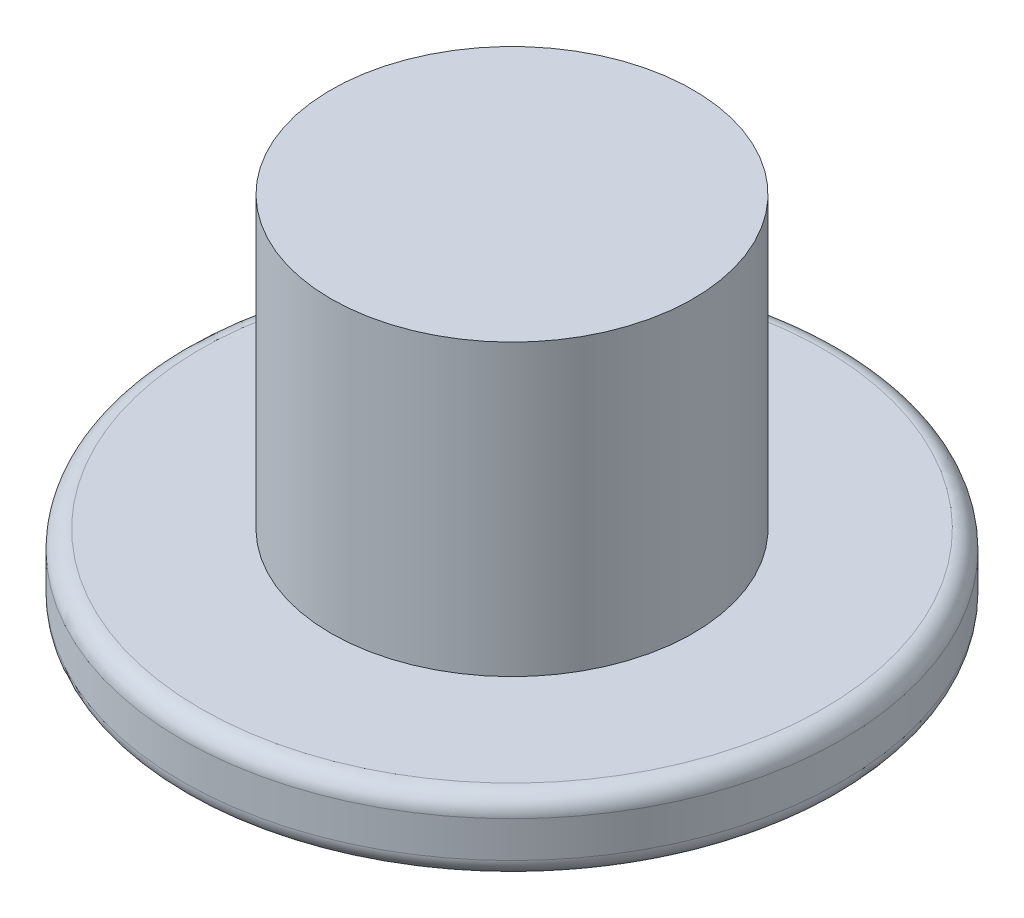
ISO-10303-21;
HEADER;
FILE_DESCRIPTION(('STEP AP214'),'2;1');
FILE_NAME('part.step','',(''),(''),'','','');
FILE_SCHEMA(('AUTOMOTIVE_DESIGN { 1 0 10303 214 1 1 1 1 }'));
ENDSEC;
DATA;
#1=APPLICATION_CONTEXT('core data for automotive mechanical design processes');
#2=APPLICATION_PROTOCOL_DEFINITION('international standard','automotive_design',2000,#1);
#3=PRODUCT_CONTEXT('',#1,'mechanical');
#4=PRODUCT('Part','Part','',(#3));
#5=PRODUCT_RELATED_PRODUCT_CATEGORY('part','',(#4));
#6=PRODUCT_DEFINITION_FORMATION('','',#4);
#7=PRODUCT_DEFINITION_CONTEXT('part definition',#1,'design');
#8=PRODUCT_DEFINITION('design','',#6,#7);
#9=PRODUCT_DEFINITION_SHAPE('','',#8);
#10=(LENGTH_UNIT() NAMED_UNIT(*) SI_UNIT(.MILLI.,.METRE.));
#11=(NAMED_UNIT(*) PLANE_ANGLE_UNIT() SI_UNIT($,.RADIAN.));
#12=(NAMED_UNIT(*) SI_UNIT($,.STERADIAN.) SOLID_ANGLE_UNIT());
#13=UNCERTAINTY_MEASURE_WITH_UNIT(LENGTH_MEASURE(1.E-05),#10,'distance_accuracy_value','');
#14=(GEOMETRIC_REPRESENTATION_CONTEXT(3) GLOBAL_UNCERTAINTY_ASSIGNED_CONTEXT((#13)) GLOBAL_UNIT_ASSIGNED_CONTEXT((#10,
#11,#12)) REPRESENTATION_CONTEXT('',''));
#15=CARTESIAN_POINT('',(0.,0.,0.));
#16=DIRECTION('',(0.,0.,1.));
#17=DIRECTION('',(1.,0.,0.));
#18=AXIS2_PLACEMENT_3D('',#15,#16,#17);
#19=CARTESIAN_POINT('',(-5.40867619744746,0.,40.306737900425));
#20=DIRECTION('',(0.,1.,0.));
#21=DIRECTION('',(0.,0.,1.));
#22=AXIS2_PLACEMENT_3D('',#19,#20,#21);
#23=PLANE('',#22);
#24=CARTESIAN_POINT('',(-5.40867619744746,0.,40.306737900425));
#25=DIRECTION('',(0.,1.,0.));
#26=DIRECTION('',(0.,0.,1.));
#27=AXIS2_PLACEMENT_3D('',#24,#25,#26);
#28=CIRCLE('',#27,8.6);
#29=CARTESIAN_POINT('',(-5.40867619744746,0.,48.906737900425));
#30=VERTEX_POINT('',#29);
#31=EDGE_CURVE('E11',#30,#30,#28,.F.);
#32=ORIENTED_EDGE('',*,*,#31,.T.);
#33=EDGE_LOOP('',(#32));
#34=FACE_BOUND('',#33,.T.);
#35=DIRECTION('',(0.487957207872981,0.,0.872867551971549));
#36=VECTOR('',#35,1.);
#37=CARTESIAN_POINT('',(-7.02368786685276,0.,43.7669081742189));
#38=LINE('',#37,#36);
#39=CARTESIAN_POINT('',(-7.02368786685276,0.,43.7669081742189));
#40=VERTEX_POINT('',#39);
#41=CARTESIAN_POINT('',(-6.44315902069891,0.,44.8053697126805));
#42=VERTEX_POINT('',#41);
#43=EDGE_CURVE('E55',#40,#42,#38,.T.);
#44=ORIENTED_EDGE('',*,*,#43,.T.);
#45=DIRECTION('',(1.,0.,0.));
#46=VECTOR('',#45,1.);
#47=CARTESIAN_POINT('',(-6.44315902069891,0.,44.8053697126805));
#48=LINE('',#47,#46);
#49=CARTESIAN_POINT('',(-4.48522632839122,0.,44.8053697126805));
#50=VERTEX_POINT('',#49);
#51=EDGE_CURVE('E131',#42,#50,#48,.T.);
#52=ORIENTED_EDGE('',*,*,#51,.T.);
#53=DIRECTION('',(0.,0.,-1.));
#54=VECTOR('',#53,1.);
#55=CARTESIAN_POINT('',(-4.48522632839122,0.,44.8053697126805));
#56=LINE('',#55,#54);
#57=CARTESIAN_POINT('',(-4.48522632839122,0.,35.8053697126805));
#58=VERTEX_POINT('',#57);
#59=EDGE_CURVE('E135',#50,#58,#56,.T.);
#60=ORIENTED_EDGE('',*,*,#59,.T.);
#61=DIRECTION('',(-1.,0.,0.));
#62=VECTOR('',#61,1.);
#63=CARTESIAN_POINT('',(-4.48522632839122,0.,35.8053697126805));
#64=LINE('',#63,#62);
#65=CARTESIAN_POINT('',(-5.63907248223737,0.,35.8053697126805));
#66=VERTEX_POINT('',#65);
#67=EDGE_CURVE('E139',#58,#66,#64,.T.);
#68=ORIENTED_EDGE('',*,*,#67,.T.);
#69=DIRECTION('',(0.,0.,1.));
#70=VECTOR('',#69,1.);
#71=CARTESIAN_POINT('',(-5.63907248223737,0.,35.8053697126805));
#72=LINE('',#71,#70);
#73=CARTESIAN_POINT('',(-5.63907248223737,0.,43.7669081742189));
#74=VERTEX_POINT('',#73);
#75=EDGE_CURVE('E117',#66,#74,#72,.T.);
#76=ORIENTED_EDGE('',*,*,#75,.T.);
#77=DIRECTION('',(-1.,0.,0.));
#78=VECTOR('',#77,1.);
#79=CARTESIAN_POINT('',(-5.63907248223737,0.,43.7669081742189));
#80=LINE('',#79,#78);
#81=EDGE_CURVE('E144',#74,#40,#80,.T.);
#82=ORIENTED_EDGE('',*,*,#81,.T.);
#83=EDGE_LOOP('',(#44,#52,#60,#68,#76,#82));
#84=FACE_BOUND('',#83,.T.);
#85=ADVANCED_FACE('F39',(#34,#84),#23,.F.);
#86=CARTESIAN_POINT('',(-5.40867619744746,2.,40.306737900425));
#87=DIRECTION('',(0.,-1.,0.));
#88=DIRECTION('',(0.,0.,-1.));
#89=AXIS2_PLACEMENT_3D('',#86,#87,#88);
#90=CYLINDRICAL_SURFACE('',#89,9.1);
#91=CARTESIAN_POINT('',(-5.40867619744746,1.5,40.306737900425));
#92=DIRECTION('',(0.,1.,0.));
#93=DIRECTION('',(0.,0.,1.));
#94=AXIS2_PLACEMENT_3D('',#91,#92,#93);
#95=CIRCLE('',#94,9.1);
#96=CARTESIAN_POINT('',(-5.40867619744746,1.5,49.406737900425));
#97=VERTEX_POINT('',#96);
#98=EDGE_CURVE('E48',#97,#97,#95,.F.);
#99=ORIENTED_EDGE('',*,*,#98,.T.);
#100=EDGE_LOOP('',(#99));
#101=FACE_BOUND('',#100,.T.);
#102=CARTESIAN_POINT('',(-5.40867619744746,0.5,40.306737900425));
#103=DIRECTION('',(0.,1.,0.));
#104=DIRECTION('',(0.,0.,1.));
#105=AXIS2_PLACEMENT_3D('',#102,#103,#104);
#106=CIRCLE('',#105,9.1);
#107=CARTESIAN_POINT('',(-5.40867619744746,0.5,49.406737900425));
#108=VERTEX_POINT('',#107);
#109=EDGE_CURVE('E173',#108,#108,#106,.T.);
#110=ORIENTED_EDGE('',*,*,#109,.T.);
#111=EDGE_LOOP('',(#110));
#112=FACE_BOUND('',#111,.T.);
#113=ADVANCED_FACE('F180',(#101,#112),#90,.T.);
#114=CARTESIAN_POINT('',(-5.40867619744746,2.,40.306737900425));
#115=DIRECTION('',(0.,1.,0.));
#116=DIRECTION('',(0.,0.,1.));
#117=AXIS2_PLACEMENT_3D('',#114,#115,#116);
#118=PLANE('',#117);
#119=CARTESIAN_POINT('',(-5.40867619744746,2.,40.306737900425));
#120=DIRECTION('',(0.,1.,0.));
#121=DIRECTION('',(0.,0.,1.));
#122=AXIS2_PLACEMENT_3D('',#119,#120,#121);
#123=CIRCLE('',#122,8.6);
#124=CARTESIAN_POINT('',(-5.40867619744746,2.,48.906737900425));
#125=VERTEX_POINT('',#124);
#126=EDGE_CURVE('E169',#125,#125,#123,.T.);
#127=ORIENTED_EDGE('',*,*,#126,.T.);
#128=EDGE_LOOP('',(#127));
#129=FACE_BOUND('',#128,.T.);
#130=CARTESIAN_POINT('',(-5.40867619744746,2.,40.306737900425));
#131=DIRECTION('',(0.,1.,0.));
#132=DIRECTION('',(0.,0.,1.));
#133=AXIS2_PLACEMENT_3D('',#130,#131,#132);
#134=CIRCLE('',#133,5.);
#135=CARTESIAN_POINT('',(-5.40867619744746,2.,45.306737900425));
#136=VERTEX_POINT('',#135);
#137=EDGE_CURVE('E165',#136,#136,#134,.T.);
#138=ORIENTED_EDGE('',*,*,#137,.F.);
#139=EDGE_LOOP('',(#138));
#140=FACE_BOUND('',#139,.T.);
#141=ADVANCED_FACE('F188',(#129,#140),#118,.T.);
#142=CARTESIAN_POINT('',(-5.40867619744746,10.,40.306737900425));
#143=DIRECTION('',(0.,-1.,0.));
#144=DIRECTION('',(0.,0.,-1.));
#145=AXIS2_PLACEMENT_3D('',#142,#143,#144);
#146=CYLINDRICAL_SURFACE('',#145,5.);
#147=CARTESIAN_POINT('',(-5.40867619744746,10.,40.306737900425));
#148=DIRECTION('',(0.,1.,0.));
#149=DIRECTION('',(0.,0.,1.));
#150=AXIS2_PLACEMENT_3D('',#147,#148,#149);
#151=CIRCLE('',#150,5.);
#152=CARTESIAN_POINT('',(-5.40867619744746,10.,45.306737900425));
#153=VERTEX_POINT('',#152);
#154=EDGE_CURVE('E161',#153,#153,#151,.T.);
#155=ORIENTED_EDGE('',*,*,#154,.F.);
#156=EDGE_LOOP('',(#155));
#157=FACE_BOUND('',#156,.T.);
#158=ORIENTED_EDGE('',*,*,#137,.T.);
#159=EDGE_LOOP('',(#158));
#160=FACE_BOUND('',#159,.T.);
#161=ADVANCED_FACE('F191',(#157,#160),#146,.T.);
#162=CARTESIAN_POINT('',(-5.40867619744746,10.,40.306737900425));
#163=DIRECTION('',(0.,1.,0.));
#164=DIRECTION('',(0.,0.,1.));
#165=AXIS2_PLACEMENT_3D('',#162,#163,#164);
#166=PLANE('',#165);
#167=ORIENTED_EDGE('',*,*,#154,.T.);
#168=EDGE_LOOP('',(#167));
#169=FACE_BOUND('',#168,.T.);
#170=ADVANCED_FACE('F196',(#169),#166,.T.);
#171=CARTESIAN_POINT('',(-7.02368786685276,0.5,43.7669081742189));
#172=DIRECTION('',(0.872867551971549,0.,-0.487957207872981));
#173=DIRECTION('',(-0.487957207872981,0.,-0.872867551971549));
#174=AXIS2_PLACEMENT_3D('',#171,#172,#173);
#175=PLANE('',#174);
#176=ORIENTED_EDGE('',*,*,#43,.F.);
#177=DIRECTION('',(0.,-1.,0.));
#178=VECTOR('',#177,1.);
#179=CARTESIAN_POINT('',(-7.02368786685276,0.5,43.7669081742189));
#180=LINE('',#179,#178);
#181=CARTESIAN_POINT('',(-7.02368786685276,0.5,43.7669081742189));
#182=VERTEX_POINT('',#181);
#183=EDGE_CURVE('E125',#182,#40,#180,.T.);
#184=ORIENTED_EDGE('',*,*,#183,.F.);
#185=DIRECTION('',(0.487957207872981,0.,0.872867551971549));
#186=VECTOR('',#185,1.);
#187=CARTESIAN_POINT('',(-7.02368786685276,0.5,43.7669081742189));
#188=LINE('',#187,#186);
#189=CARTESIAN_POINT('',(-6.44315902069891,0.5,44.8053697126805));
#190=VERTEX_POINT('',#189);
#191=EDGE_CURVE('E148',#182,#190,#188,.T.);
#192=ORIENTED_EDGE('',*,*,#191,.T.);
#193=DIRECTION('',(0.,-1.,0.));
#194=VECTOR('',#193,1.);
#195=CARTESIAN_POINT('',(-6.44315902069891,0.5,44.8053697126805));
#196=LINE('',#195,#194);
#197=EDGE_CURVE('E158',#190,#42,#196,.T.);
#198=ORIENTED_EDGE('',*,*,#197,.T.);
#199=EDGE_LOOP('',(#176,#184,#192,#198));
#200=FACE_BOUND('',#199,.T.);
#201=ADVANCED_FACE('F202',(#200),#175,.T.);
#202=CARTESIAN_POINT('',(-6.44315902069891,0.5,44.8053697126805));
#203=DIRECTION('',(0.,0.,-1.));
#204=DIRECTION('',(-1.,0.,0.));
#205=AXIS2_PLACEMENT_3D('',#202,#203,#204);
#206=PLANE('',#205);
#207=ORIENTED_EDGE('',*,*,#51,.F.);
#208=ORIENTED_EDGE('',*,*,#197,.F.);
#209=DIRECTION('',(1.,0.,0.));
#210=VECTOR('',#209,1.);
#211=CARTESIAN_POINT('',(-6.44315902069891,0.5,44.8053697126805));
#212=LINE('',#211,#210);
#213=CARTESIAN_POINT('',(-4.48522632839122,0.5,44.8053697126805));
#214=VERTEX_POINT('',#213);
#215=EDGE_CURVE('E94',#190,#214,#212,.T.);
#216=ORIENTED_EDGE('',*,*,#215,.T.);
#217=DIRECTION('',(0.,-1.,0.));
#218=VECTOR('',#217,1.);
#219=CARTESIAN_POINT('',(-4.48522632839122,0.5,44.8053697126805));
#220=LINE('',#219,#218);
#221=EDGE_CURVE('E155',#214,#50,#220,.T.);
#222=ORIENTED_EDGE('',*,*,#221,.T.);
#223=EDGE_LOOP('',(#207,#208,#216,#222));
#224=FACE_BOUND('',#223,.T.);
#225=ADVANCED_FACE('F227',(#224),#206,.T.);
#226=CARTESIAN_POINT('',(-4.48522632839122,0.5,44.8053697126805));
#227=DIRECTION('',(-1.,0.,0.));
#228=DIRECTION('',(0.,0.,1.));
#229=AXIS2_PLACEMENT_3D('',#226,#227,#228);
#230=PLANE('',#229);
#231=ORIENTED_EDGE('',*,*,#59,.F.);
#232=ORIENTED_EDGE('',*,*,#221,.F.);
#233=DIRECTION('',(0.,0.,-1.));
#234=VECTOR('',#233,1.);
#235=CARTESIAN_POINT('',(-4.48522632839122,0.5,44.8053697126805));
#236=LINE('',#235,#234);
#237=CARTESIAN_POINT('',(-4.48522632839122,0.5,35.8053697126805));
#238=VERTEX_POINT('',#237);
#239=EDGE_CURVE('E113',#214,#238,#236,.T.);
#240=ORIENTED_EDGE('',*,*,#239,.T.);
#241=DIRECTION('',(0.,-1.,0.));
#242=VECTOR('',#241,1.);
#243=CARTESIAN_POINT('',(-4.48522632839122,0.5,35.8053697126805));
#244=LINE('',#243,#242);
#245=EDGE_CURVE('E109',#238,#58,#244,.T.);
#246=ORIENTED_EDGE('',*,*,#245,.T.);
#247=EDGE_LOOP('',(#231,#232,#240,#246));
#248=FACE_BOUND('',#247,.T.);
#249=ADVANCED_FACE('F225',(#248),#230,.T.);
#250=CARTESIAN_POINT('',(-4.48522632839122,0.5,35.8053697126805));
#251=DIRECTION('',(0.,0.,1.));
#252=DIRECTION('',(1.,0.,0.));
#253=AXIS2_PLACEMENT_3D('',#250,#251,#252);
#254=PLANE('',#253);
#255=ORIENTED_EDGE('',*,*,#67,.F.);
#256=ORIENTED_EDGE('',*,*,#245,.F.);
#257=DIRECTION('',(-1.,0.,0.));
#258=VECTOR('',#257,1.);
#259=CARTESIAN_POINT('',(-4.48522632839122,0.5,35.8053697126805));
#260=LINE('',#259,#258);
#261=CARTESIAN_POINT('',(-5.63907248223737,0.5,35.8053697126805));
#262=VERTEX_POINT('',#261);
#263=EDGE_CURVE('E104',#238,#262,#260,.T.);
#264=ORIENTED_EDGE('',*,*,#263,.T.);
#265=DIRECTION('',(0.,-1.,0.));
#266=VECTOR('',#265,1.);
#267=CARTESIAN_POINT('',(-5.63907248223737,0.5,35.8053697126805));
#268=LINE('',#267,#266);
#269=EDGE_CURVE('E108',#262,#66,#268,.T.);
#270=ORIENTED_EDGE('',*,*,#269,.T.);
#271=EDGE_LOOP('',(#255,#256,#264,#270));
#272=FACE_BOUND('',#271,.T.);
#273=ADVANCED_FACE('F107',(#272),#254,.T.);
#274=CARTESIAN_POINT('',(-5.63907248223737,0.5,35.8053697126805));
#275=DIRECTION('',(1.,0.,0.));
#276=DIRECTION('',(0.,0.,-1.));
#277=AXIS2_PLACEMENT_3D('',#274,#275,#276);
#278=PLANE('',#277);
#279=ORIENTED_EDGE('',*,*,#75,.F.);
#280=ORIENTED_EDGE('',*,*,#269,.F.);
#281=DIRECTION('',(0.,0.,1.));
#282=VECTOR('',#281,1.);
#283=CARTESIAN_POINT('',(-5.63907248223737,0.5,35.8053697126805));
#284=LINE('',#283,#282);
#285=CARTESIAN_POINT('',(-5.63907248223737,0.5,43.7669081742189));
#286=VERTEX_POINT('',#285);
#287=EDGE_CURVE('E112',#262,#286,#284,.T.);
#288=ORIENTED_EDGE('',*,*,#287,.T.);
#289=DIRECTION('',(0.,-1.,0.));
#290=VECTOR('',#289,1.);
#291=CARTESIAN_POINT('',(-5.63907248223737,0.5,43.7669081742189));
#292=LINE('',#291,#290);
#293=EDGE_CURVE('E85',#286,#74,#292,.T.);
#294=ORIENTED_EDGE('',*,*,#293,.T.);
#295=EDGE_LOOP('',(#279,#280,#288,#294));
#296=FACE_BOUND('',#295,.T.);
#297=ADVANCED_FACE('F115',(#296),#278,.T.);
#298=CARTESIAN_POINT('',(-5.63907248223737,0.5,43.7669081742189));
#299=DIRECTION('',(0.,0.,1.));
#300=DIRECTION('',(1.,0.,0.));
#301=AXIS2_PLACEMENT_3D('',#298,#299,#300);
#302=PLANE('',#301);
#303=ORIENTED_EDGE('',*,*,#81,.F.);
#304=ORIENTED_EDGE('',*,*,#293,.F.);
#305=DIRECTION('',(-1.,0.,0.));
#306=VECTOR('',#305,1.);
#307=CARTESIAN_POINT('',(-5.63907248223737,0.5,43.7669081742189));
#308=LINE('',#307,#306);
#309=EDGE_CURVE('E63',#286,#182,#308,.T.);
#310=ORIENTED_EDGE('',*,*,#309,.T.);
#311=ORIENTED_EDGE('',*,*,#183,.T.);
#312=EDGE_LOOP('',(#303,#304,#310,#311));
#313=FACE_BOUND('',#312,.T.);
#314=ADVANCED_FACE('F215',(#313),#302,.T.);
#315=CARTESIAN_POINT('',(0.,0.5,0.));
#316=DIRECTION('',(0.,1.,0.));
#317=DIRECTION('',(0.,0.,1.));
#318=AXIS2_PLACEMENT_3D('',#315,#316,#317);
#319=PLANE('',#318);
#320=ORIENTED_EDGE('',*,*,#191,.F.);
#321=ORIENTED_EDGE('',*,*,#309,.F.);
#322=ORIENTED_EDGE('',*,*,#287,.F.);
#323=ORIENTED_EDGE('',*,*,#263,.F.);
#324=ORIENTED_EDGE('',*,*,#239,.F.);
#325=ORIENTED_EDGE('',*,*,#215,.F.);
#326=EDGE_LOOP('',(#320,#321,#322,#323,#324,#325));
#327=FACE_BOUND('',#326,.T.);
#328=ADVANCED_FACE('F121',(#327),#319,.F.);
#329=CARTESIAN_POINT('',(-5.40867619744746,1.5,40.306737900425));
#330=DIRECTION('',(0.,1.,0.));
#331=DIRECTION('',(0.,0.,1.));
#332=AXIS2_PLACEMENT_3D('',#329,#330,#331);
#333=TOROIDAL_SURFACE('',#332,8.6,0.5);
#334=ORIENTED_EDGE('',*,*,#98,.F.);
#335=EDGE_LOOP('',(#334));
#336=FACE_BOUND('',#335,.T.);
#337=ORIENTED_EDGE('',*,*,#126,.F.);
#338=EDGE_LOOP('',(#337));
#339=FACE_BOUND('',#338,.T.);
#340=ADVANCED_FACE('F183',(#336,#339),#333,.T.);
#341=CARTESIAN_POINT('',(-5.40867619744746,0.5,40.306737900425));
#342=DIRECTION('',(0.,1.,0.));
#343=DIRECTION('',(0.,0.,1.));
#344=AXIS2_PLACEMENT_3D('',#341,#342,#343);
#345=TOROIDAL_SURFACE('',#344,8.6,0.5);
#346=ORIENTED_EDGE('',*,*,#31,.F.);
#347=EDGE_LOOP('',(#346));
#348=FACE_BOUND('',#347,.T.);
#349=ORIENTED_EDGE('',*,*,#109,.F.);
#350=EDGE_LOOP('',(#349));
#351=FACE_BOUND('',#350,.T.);
#352=ADVANCED_FACE('F41',(#348,#351),#345,.T.);
#353=CLOSED_SHELL('',(#85,#113,#141,#161,#170,#201,#225,#249,#273,#297,#314,#328,#340,#352));
#354=MANIFOLD_SOLID_BREP('B2',#353);
#355=ADVANCED_BREP_SHAPE_REPRESENTATION('',(#18,#354),#14);
#356=SHAPE_DEFINITION_REPRESENTATION(#9,#355);
ENDSEC;
END-ISO-10303-21;
